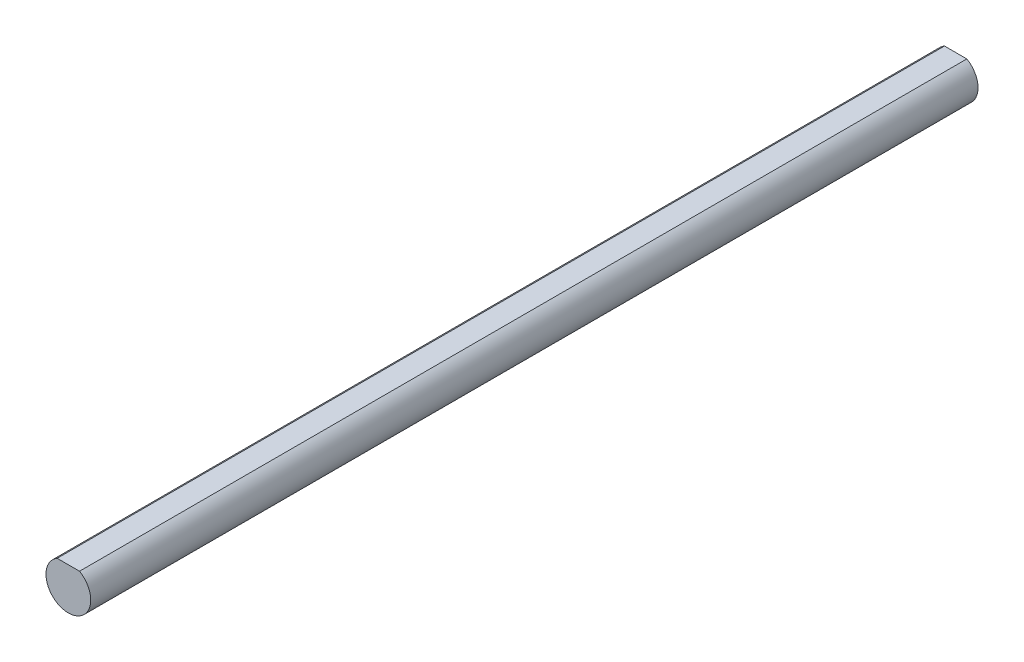
ISO-10303-21;
HEADER;
FILE_DESCRIPTION(('STEP AP214'),'2;1');
FILE_NAME('part.step','',(''),(''),'','','');
FILE_SCHEMA(('AUTOMOTIVE_DESIGN { 1 0 10303 214 1 1 1 1 }'));
ENDSEC;
DATA;
#1=APPLICATION_CONTEXT('core data for automotive mechanical design processes');
#2=APPLICATION_PROTOCOL_DEFINITION('international standard','automotive_design',2000,#1);
#3=PRODUCT_CONTEXT('',#1,'mechanical');
#4=PRODUCT('Part','Part','',(#3));
#5=PRODUCT_RELATED_PRODUCT_CATEGORY('part','',(#4));
#6=PRODUCT_DEFINITION_FORMATION('','',#4);
#7=PRODUCT_DEFINITION_CONTEXT('part definition',#1,'design');
#8=PRODUCT_DEFINITION('design','',#6,#7);
#9=PRODUCT_DEFINITION_SHAPE('','',#8);
#10=(LENGTH_UNIT() NAMED_UNIT(*) SI_UNIT(.MILLI.,.METRE.));
#11=(NAMED_UNIT(*) PLANE_ANGLE_UNIT() SI_UNIT($,.RADIAN.));
#12=(NAMED_UNIT(*) SI_UNIT($,.STERADIAN.) SOLID_ANGLE_UNIT());
#13=UNCERTAINTY_MEASURE_WITH_UNIT(LENGTH_MEASURE(1.E-05),#10,'distance_accuracy_value','');
#14=(GEOMETRIC_REPRESENTATION_CONTEXT(3) GLOBAL_UNCERTAINTY_ASSIGNED_CONTEXT((#13)) GLOBAL_UNIT_ASSIGNED_CONTEXT((#10,
#11,#12)) REPRESENTATION_CONTEXT('',''));
#15=CARTESIAN_POINT('',(0.,0.,0.));
#16=DIRECTION('',(0.,0.,1.));
#17=DIRECTION('',(1.,0.,0.));
#18=AXIS2_PLACEMENT_3D('',#15,#16,#17);
#19=CARTESIAN_POINT('',(0.,0.,119.));
#20=DIRECTION('',(0.,0.,-1.));
#21=DIRECTION('',(-1.,0.,0.));
#22=AXIS2_PLACEMENT_3D('',#19,#20,#21);
#23=CYLINDRICAL_SURFACE('',#22,3.);
#24=CARTESIAN_POINT('',(0.,0.,0.));
#25=DIRECTION('',(0.,0.,1.));
#26=DIRECTION('',(1.,0.,0.));
#27=AXIS2_PLACEMENT_3D('',#24,#25,#26);
#28=CIRCLE('',#27,3.);
#29=CARTESIAN_POINT('',(-1.5,2.59807621135332,0.));
#30=VERTEX_POINT('',#29);
#31=CARTESIAN_POINT('',(1.5,2.59807621135332,0.));
#32=VERTEX_POINT('',#31);
#33=EDGE_CURVE('E68',#30,#32,#28,.T.);
#34=ORIENTED_EDGE('',*,*,#33,.T.);
#35=DIRECTION('',(0.,0.,-1.));
#36=VECTOR('',#35,1.);
#37=CARTESIAN_POINT('',(1.5,2.59807621135332,119.));
#38=LINE('',#37,#36);
#39=CARTESIAN_POINT('',(1.5,2.59807621135332,119.));
#40=VERTEX_POINT('',#39);
#41=EDGE_CURVE('E11',#40,#32,#38,.T.);
#42=ORIENTED_EDGE('',*,*,#41,.F.);
#43=CARTESIAN_POINT('',(0.,0.,119.));
#44=DIRECTION('',(0.,0.,1.));
#45=DIRECTION('',(1.,0.,0.));
#46=AXIS2_PLACEMENT_3D('',#43,#44,#45);
#47=CIRCLE('',#46,3.);
#48=CARTESIAN_POINT('',(-1.5,2.59807621135332,119.));
#49=VERTEX_POINT('',#48);
#50=EDGE_CURVE('E67',#49,#40,#47,.T.);
#51=ORIENTED_EDGE('',*,*,#50,.F.);
#52=DIRECTION('',(0.,0.,-1.));
#53=VECTOR('',#52,1.);
#54=CARTESIAN_POINT('',(-1.5,2.59807621135332,119.));
#55=LINE('',#54,#53);
#56=EDGE_CURVE('E45',#49,#30,#55,.T.);
#57=ORIENTED_EDGE('',*,*,#56,.T.);
#58=EDGE_LOOP('',(#34,#42,#51,#57));
#59=FACE_BOUND('',#58,.T.);
#60=ADVANCED_FACE('F37',(#59),#23,.T.);
#61=CARTESIAN_POINT('',(-1.5,2.59807621135332,119.));
#62=DIRECTION('',(0.,-1.,0.));
#63=DIRECTION('',(0.,0.,-1.));
#64=AXIS2_PLACEMENT_3D('',#61,#62,#63);
#65=PLANE('',#64);
#66=DIRECTION('',(-1.,0.,0.));
#67=VECTOR('',#66,1.);
#68=CARTESIAN_POINT('',(-1.5,2.59807621135332,0.));
#69=LINE('',#68,#67);
#70=EDGE_CURVE('E60',#32,#30,#69,.T.);
#71=ORIENTED_EDGE('',*,*,#70,.T.);
#72=ORIENTED_EDGE('',*,*,#56,.F.);
#73=DIRECTION('',(-1.,0.,0.));
#74=VECTOR('',#73,1.);
#75=CARTESIAN_POINT('',(-1.5,2.59807621135332,119.));
#76=LINE('',#75,#74);
#77=EDGE_CURVE('E52',#40,#49,#76,.T.);
#78=ORIENTED_EDGE('',*,*,#77,.F.);
#79=ORIENTED_EDGE('',*,*,#41,.T.);
#80=EDGE_LOOP('',(#71,#72,#78,#79));
#81=FACE_BOUND('',#80,.T.);
#82=ADVANCED_FACE('F63',(#81),#65,.F.);
#83=CARTESIAN_POINT('',(0.,0.,119.));
#84=DIRECTION('',(0.,0.,1.));
#85=DIRECTION('',(1.,0.,0.));
#86=AXIS2_PLACEMENT_3D('',#83,#84,#85);
#87=PLANE('',#86);
#88=ORIENTED_EDGE('',*,*,#50,.T.);
#89=ORIENTED_EDGE('',*,*,#77,.T.);
#90=EDGE_LOOP('',(#88,#89));
#91=FACE_BOUND('',#90,.T.);
#92=ADVANCED_FACE('F75',(#91),#87,.T.);
#93=CARTESIAN_POINT('',(0.,0.,0.));
#94=DIRECTION('',(0.,0.,1.));
#95=DIRECTION('',(1.,0.,0.));
#96=AXIS2_PLACEMENT_3D('',#93,#94,#95);
#97=PLANE('',#96);
#98=ORIENTED_EDGE('',*,*,#33,.F.);
#99=ORIENTED_EDGE('',*,*,#70,.F.);
#100=EDGE_LOOP('',(#98,#99));
#101=FACE_BOUND('',#100,.T.);
#102=ADVANCED_FACE('F71',(#101),#97,.F.);
#103=CLOSED_SHELL('',(#60,#82,#92,#102));
#104=MANIFOLD_SOLID_BREP('B2',#103);
#105=ADVANCED_BREP_SHAPE_REPRESENTATION('',(#18,#104),#14);
#106=SHAPE_DEFINITION_REPRESENTATION(#9,#105);
ENDSEC;
END-ISO-10303-21;
